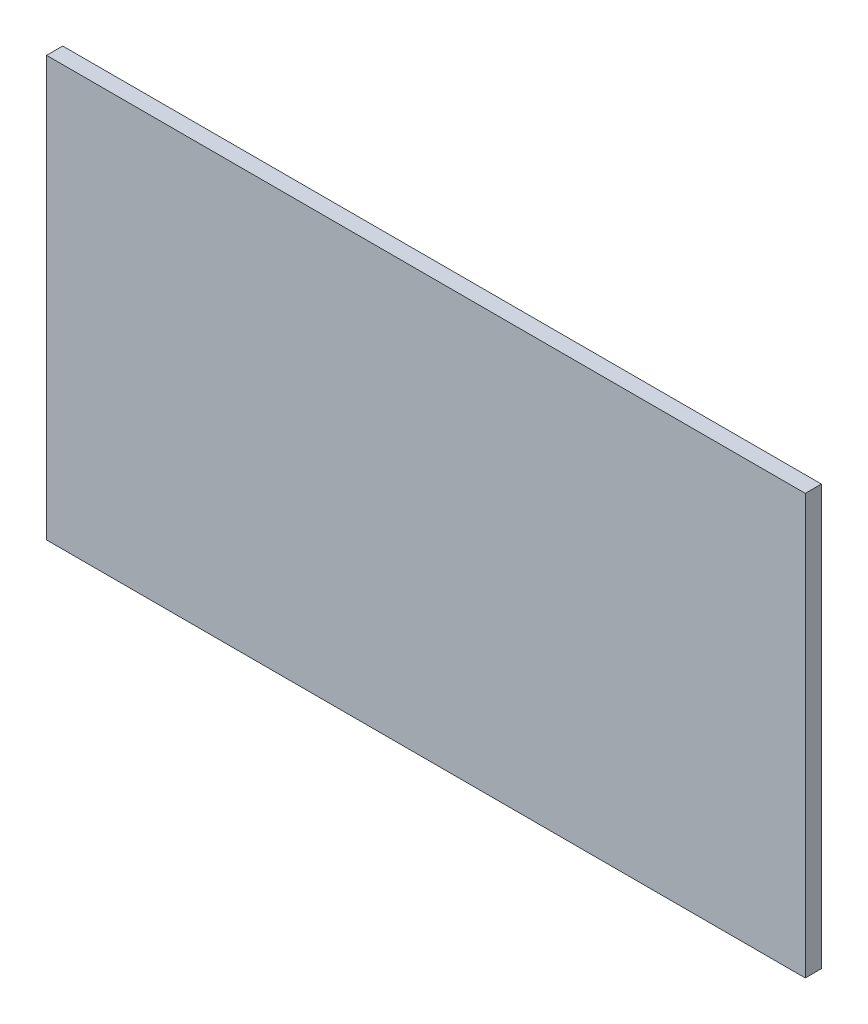
ISO-10303-21;
HEADER;
FILE_DESCRIPTION(('STEP AP214'),'2;1');
FILE_NAME('part.step','',(''),(''),'','','');
FILE_SCHEMA(('AUTOMOTIVE_DESIGN { 1 0 10303 214 1 1 1 1 }'));
ENDSEC;
DATA;
#1=APPLICATION_CONTEXT('core data for automotive mechanical design processes');
#2=APPLICATION_PROTOCOL_DEFINITION('international standard','automotive_design',2000,#1);
#3=PRODUCT_CONTEXT('',#1,'mechanical');
#4=PRODUCT('Part','Part','',(#3));
#5=PRODUCT_RELATED_PRODUCT_CATEGORY('part','',(#4));
#6=PRODUCT_DEFINITION_FORMATION('','',#4);
#7=PRODUCT_DEFINITION_CONTEXT('part definition',#1,'design');
#8=PRODUCT_DEFINITION('design','',#6,#7);
#9=PRODUCT_DEFINITION_SHAPE('','',#8);
#10=(LENGTH_UNIT() NAMED_UNIT(*) SI_UNIT(.MILLI.,.METRE.));
#11=(NAMED_UNIT(*) PLANE_ANGLE_UNIT() SI_UNIT($,.RADIAN.));
#12=(NAMED_UNIT(*) SI_UNIT($,.STERADIAN.) SOLID_ANGLE_UNIT());
#13=UNCERTAINTY_MEASURE_WITH_UNIT(LENGTH_MEASURE(1.E-05),#10,'distance_accuracy_value','');
#14=(GEOMETRIC_REPRESENTATION_CONTEXT(3) GLOBAL_UNCERTAINTY_ASSIGNED_CONTEXT((#13)) GLOBAL_UNIT_ASSIGNED_CONTEXT((#10,
#11,#12)) REPRESENTATION_CONTEXT('',''));
#15=CARTESIAN_POINT('',(0.,0.,0.));
#16=DIRECTION('',(0.,0.,1.));
#17=DIRECTION('',(1.,0.,0.));
#18=AXIS2_PLACEMENT_3D('',#15,#16,#17);
#19=CARTESIAN_POINT('',(-3.88690176456177,13.703029385592,39.9590420054778));
#20=DIRECTION('',(-1.,0.,0.));
#21=DIRECTION('',(0.,0.,1.));
#22=AXIS2_PLACEMENT_3D('',#19,#20,#21);
#23=PLANE('',#22);
#24=DIRECTION('',(0.,-1.,0.));
#25=VECTOR('',#24,1.);
#26=CARTESIAN_POINT('',(-3.88690176456177,13.703029385592,40.9590420054778));
#27=LINE('',#26,#25);
#28=CARTESIAN_POINT('',(-3.88690176456177,37.703029385592,40.9590420054778));
#29=VERTEX_POINT('',#28);
#30=CARTESIAN_POINT('',(-3.88690176456177,13.703029385592,40.9590420054778));
#31=VERTEX_POINT('',#30);
#32=EDGE_CURVE('E128',#29,#31,#27,.T.);
#33=ORIENTED_EDGE('',*,*,#32,.F.);
#34=DIRECTION('',(0.,0.,1.));
#35=VECTOR('',#34,1.);
#36=CARTESIAN_POINT('',(-3.88690176456177,37.703029385592,39.9590420054778));
#37=LINE('',#36,#35);
#38=CARTESIAN_POINT('',(-3.88690176456177,37.703029385592,39.9590420054778));
#39=VERTEX_POINT('',#38);
#40=EDGE_CURVE('E11',#39,#29,#37,.T.);
#41=ORIENTED_EDGE('',*,*,#40,.F.);
#42=DIRECTION('',(0.,-1.,0.));
#43=VECTOR('',#42,1.);
#44=CARTESIAN_POINT('',(-3.88690176456177,13.703029385592,39.9590420054778));
#45=LINE('',#44,#43);
#46=CARTESIAN_POINT('',(-3.88690176456177,13.703029385592,39.9590420054778));
#47=VERTEX_POINT('',#46);
#48=EDGE_CURVE('E137',#39,#47,#45,.T.);
#49=ORIENTED_EDGE('',*,*,#48,.T.);
#50=DIRECTION('',(0.,0.,1.));
#51=VECTOR('',#50,1.);
#52=CARTESIAN_POINT('',(-3.88690176456177,13.703029385592,39.9590420054778));
#53=LINE('',#52,#51);
#54=EDGE_CURVE('E36',#47,#31,#53,.T.);
#55=ORIENTED_EDGE('',*,*,#54,.T.);
#56=EDGE_LOOP('',(#33,#41,#49,#55));
#57=FACE_BOUND('',#56,.T.);
#58=ADVANCED_FACE('F33',(#57),#23,.T.);
#59=CARTESIAN_POINT('',(-3.88690176456177,37.703029385592,39.9590420054778));
#60=DIRECTION('',(0.,1.,0.));
#61=DIRECTION('',(0.,0.,1.));
#62=AXIS2_PLACEMENT_3D('',#59,#60,#61);
#63=PLANE('',#62);
#64=DIRECTION('',(-1.,0.,0.));
#65=VECTOR('',#64,1.);
#66=CARTESIAN_POINT('',(-3.88690176456177,37.703029385592,40.9590420054778));
#67=LINE('',#66,#65);
#68=CARTESIAN_POINT('',(41.1130982354382,37.703029385592,40.9590420054778));
#69=VERTEX_POINT('',#68);
#70=EDGE_CURVE('E140',#69,#29,#67,.T.);
#71=ORIENTED_EDGE('',*,*,#70,.F.);
#72=DIRECTION('',(0.,0.,1.));
#73=VECTOR('',#72,1.);
#74=CARTESIAN_POINT('',(41.1130982354382,37.703029385592,39.9590420054778));
#75=LINE('',#74,#73);
#76=CARTESIAN_POINT('',(41.1130982354382,37.703029385592,39.9590420054778));
#77=VERTEX_POINT('',#76);
#78=EDGE_CURVE('E42',#77,#69,#75,.T.);
#79=ORIENTED_EDGE('',*,*,#78,.F.);
#80=DIRECTION('',(-1.,0.,0.));
#81=VECTOR('',#80,1.);
#82=CARTESIAN_POINT('',(-3.88690176456177,37.703029385592,39.9590420054778));
#83=LINE('',#82,#81);
#84=EDGE_CURVE('E144',#77,#39,#83,.T.);
#85=ORIENTED_EDGE('',*,*,#84,.T.);
#86=ORIENTED_EDGE('',*,*,#40,.T.);
#87=EDGE_LOOP('',(#71,#79,#85,#86));
#88=FACE_BOUND('',#87,.T.);
#89=ADVANCED_FACE('F159',(#88),#63,.T.);
#90=CARTESIAN_POINT('',(41.1130982354382,13.703029385592,39.9590420054778));
#91=DIRECTION('',(1.,0.,0.));
#92=DIRECTION('',(0.,0.,-1.));
#93=AXIS2_PLACEMENT_3D('',#90,#91,#92);
#94=PLANE('',#93);
#95=DIRECTION('',(0.,1.,0.));
#96=VECTOR('',#95,1.);
#97=CARTESIAN_POINT('',(41.1130982354382,13.703029385592,40.9590420054778));
#98=LINE('',#97,#96);
#99=CARTESIAN_POINT('',(41.1130982354382,13.703029385592,40.9590420054778));
#100=VERTEX_POINT('',#99);
#101=EDGE_CURVE('E148',#100,#69,#98,.T.);
#102=ORIENTED_EDGE('',*,*,#101,.F.);
#103=DIRECTION('',(0.,0.,1.));
#104=VECTOR('',#103,1.);
#105=CARTESIAN_POINT('',(41.1130982354382,13.703029385592,39.9590420054778));
#106=LINE('',#105,#104);
#107=CARTESIAN_POINT('',(41.1130982354382,13.703029385592,39.9590420054778));
#108=VERTEX_POINT('',#107);
#109=EDGE_CURVE('E153',#108,#100,#106,.T.);
#110=ORIENTED_EDGE('',*,*,#109,.F.);
#111=DIRECTION('',(0.,1.,0.));
#112=VECTOR('',#111,1.);
#113=CARTESIAN_POINT('',(41.1130982354382,13.703029385592,39.9590420054778));
#114=LINE('',#113,#112);
#115=EDGE_CURVE('E142',#108,#77,#114,.T.);
#116=ORIENTED_EDGE('',*,*,#115,.T.);
#117=ORIENTED_EDGE('',*,*,#78,.T.);
#118=EDGE_LOOP('',(#102,#110,#116,#117));
#119=FACE_BOUND('',#118,.T.);
#120=ADVANCED_FACE('F162',(#119),#94,.T.);
#121=CARTESIAN_POINT('',(-3.88690176456177,13.703029385592,39.9590420054778));
#122=DIRECTION('',(0.,-1.,0.));
#123=DIRECTION('',(0.,0.,-1.));
#124=AXIS2_PLACEMENT_3D('',#121,#122,#123);
#125=PLANE('',#124);
#126=DIRECTION('',(1.,0.,0.));
#127=VECTOR('',#126,1.);
#128=CARTESIAN_POINT('',(-3.88690176456177,13.703029385592,40.9590420054778));
#129=LINE('',#128,#127);
#130=EDGE_CURVE('E131',#31,#100,#129,.T.);
#131=ORIENTED_EDGE('',*,*,#130,.F.);
#132=ORIENTED_EDGE('',*,*,#54,.F.);
#133=DIRECTION('',(1.,0.,0.));
#134=VECTOR('',#133,1.);
#135=CARTESIAN_POINT('',(-3.88690176456177,13.703029385592,39.9590420054778));
#136=LINE('',#135,#134);
#137=EDGE_CURVE('E139',#47,#108,#136,.T.);
#138=ORIENTED_EDGE('',*,*,#137,.T.);
#139=ORIENTED_EDGE('',*,*,#109,.T.);
#140=EDGE_LOOP('',(#131,#132,#138,#139));
#141=FACE_BOUND('',#140,.T.);
#142=ADVANCED_FACE('F155',(#141),#125,.T.);
#143=CARTESIAN_POINT('',(0.,0.,39.9590420054778));
#144=DIRECTION('',(0.,0.,-1.));
#145=DIRECTION('',(-1.,0.,0.));
#146=AXIS2_PLACEMENT_3D('',#143,#144,#145);
#147=PLANE('',#146);
#148=ORIENTED_EDGE('',*,*,#48,.F.);
#149=ORIENTED_EDGE('',*,*,#84,.F.);
#150=ORIENTED_EDGE('',*,*,#115,.F.);
#151=ORIENTED_EDGE('',*,*,#137,.F.);
#152=EDGE_LOOP('',(#148,#149,#150,#151));
#153=FACE_BOUND('',#152,.T.);
#154=ADVANCED_FACE('F164',(#153),#147,.T.);
#155=CARTESIAN_POINT('',(-4.88690176456177,38.703029385592,41.9590420054778));
#156=DIRECTION('',(1.,0.,0.));
#157=DIRECTION('',(0.,0.,-1.));
#158=AXIS2_PLACEMENT_3D('',#155,#156,#157);
#159=PLANE('',#158);
#160=DIRECTION('',(0.,-1.,0.));
#161=VECTOR('',#160,1.);
#162=CARTESIAN_POINT('',(-4.88690176456177,38.703029385592,40.9590420054778));
#163=LINE('',#162,#161);
#164=CARTESIAN_POINT('',(-4.88690176456177,38.703029385592,40.9590420054778));
#165=VERTEX_POINT('',#164);
#166=CARTESIAN_POINT('',(-4.88690176456177,12.703029385592,40.9590420054778));
#167=VERTEX_POINT('',#166);
#168=EDGE_CURVE('E127',#165,#167,#163,.T.);
#169=ORIENTED_EDGE('',*,*,#168,.T.);
#170=DIRECTION('',(0.,0.,-1.));
#171=VECTOR('',#170,1.);
#172=CARTESIAN_POINT('',(-4.88690176456177,12.703029385592,41.9590420054778));
#173=LINE('',#172,#171);
#174=CARTESIAN_POINT('',(-4.88690176456177,12.703029385592,41.9590420054778));
#175=VERTEX_POINT('',#174);
#176=EDGE_CURVE('E107',#175,#167,#173,.T.);
#177=ORIENTED_EDGE('',*,*,#176,.F.);
#178=DIRECTION('',(0.,-1.,0.));
#179=VECTOR('',#178,1.);
#180=CARTESIAN_POINT('',(-4.88690176456177,38.703029385592,41.9590420054778));
#181=LINE('',#180,#179);
#182=CARTESIAN_POINT('',(-4.88690176456177,38.703029385592,41.9590420054778));
#183=VERTEX_POINT('',#182);
#184=EDGE_CURVE('E114',#183,#175,#181,.T.);
#185=ORIENTED_EDGE('',*,*,#184,.F.);
#186=DIRECTION('',(0.,0.,-1.));
#187=VECTOR('',#186,1.);
#188=CARTESIAN_POINT('',(-4.88690176456177,38.703029385592,41.9590420054778));
#189=LINE('',#188,#187);
#190=EDGE_CURVE('E244',#183,#165,#189,.T.);
#191=ORIENTED_EDGE('',*,*,#190,.T.);
#192=EDGE_LOOP('',(#169,#177,#185,#191));
#193=FACE_BOUND('',#192,.T.);
#194=ADVANCED_FACE('F125',(#193),#159,.F.);
#195=CARTESIAN_POINT('',(-4.88690176456177,12.703029385592,41.9590420054778));
#196=DIRECTION('',(0.,1.,0.));
#197=DIRECTION('',(0.,0.,1.));
#198=AXIS2_PLACEMENT_3D('',#195,#196,#197);
#199=PLANE('',#198);
#200=DIRECTION('',(1.,0.,0.));
#201=VECTOR('',#200,1.);
#202=CARTESIAN_POINT('',(-4.88690176456177,12.703029385592,40.9590420054778));
#203=LINE('',#202,#201);
#204=CARTESIAN_POINT('',(42.1130982354382,12.703029385592,40.9590420054778));
#205=VERTEX_POINT('',#204);
#206=EDGE_CURVE('E250',#167,#205,#203,.T.);
#207=ORIENTED_EDGE('',*,*,#206,.T.);
#208=DIRECTION('',(0.,0.,-1.));
#209=VECTOR('',#208,1.);
#210=CARTESIAN_POINT('',(42.1130982354382,12.703029385592,41.9590420054778));
#211=LINE('',#210,#209);
#212=CARTESIAN_POINT('',(42.1130982354382,12.703029385592,41.9590420054778));
#213=VERTEX_POINT('',#212);
#214=EDGE_CURVE('E110',#213,#205,#211,.T.);
#215=ORIENTED_EDGE('',*,*,#214,.F.);
#216=DIRECTION('',(1.,0.,0.));
#217=VECTOR('',#216,1.);
#218=CARTESIAN_POINT('',(-4.88690176456177,12.703029385592,41.9590420054778));
#219=LINE('',#218,#217);
#220=EDGE_CURVE('E103',#175,#213,#219,.T.);
#221=ORIENTED_EDGE('',*,*,#220,.F.);
#222=ORIENTED_EDGE('',*,*,#176,.T.);
#223=EDGE_LOOP('',(#207,#215,#221,#222));
#224=FACE_BOUND('',#223,.T.);
#225=ADVANCED_FACE('F105',(#224),#199,.F.);
#226=CARTESIAN_POINT('',(42.1130982354382,38.703029385592,41.9590420054778));
#227=DIRECTION('',(-1.,0.,0.));
#228=DIRECTION('',(0.,0.,1.));
#229=AXIS2_PLACEMENT_3D('',#226,#227,#228);
#230=PLANE('',#229);
#231=DIRECTION('',(0.,1.,0.));
#232=VECTOR('',#231,1.);
#233=CARTESIAN_POINT('',(42.1130982354382,38.703029385592,40.9590420054778));
#234=LINE('',#233,#232);
#235=CARTESIAN_POINT('',(42.1130982354382,38.703029385592,40.9590420054778));
#236=VERTEX_POINT('',#235);
#237=EDGE_CURVE('E247',#205,#236,#234,.T.);
#238=ORIENTED_EDGE('',*,*,#237,.T.);
#239=DIRECTION('',(0.,0.,-1.));
#240=VECTOR('',#239,1.);
#241=CARTESIAN_POINT('',(42.1130982354382,38.703029385592,41.9590420054778));
#242=LINE('',#241,#240);
#243=CARTESIAN_POINT('',(42.1130982354382,38.703029385592,41.9590420054778));
#244=VERTEX_POINT('',#243);
#245=EDGE_CURVE('E133',#244,#236,#242,.T.);
#246=ORIENTED_EDGE('',*,*,#245,.F.);
#247=DIRECTION('',(0.,1.,0.));
#248=VECTOR('',#247,1.);
#249=CARTESIAN_POINT('',(42.1130982354382,38.703029385592,41.9590420054778));
#250=LINE('',#249,#248);
#251=EDGE_CURVE('E113',#213,#244,#250,.T.);
#252=ORIENTED_EDGE('',*,*,#251,.F.);
#253=ORIENTED_EDGE('',*,*,#214,.T.);
#254=EDGE_LOOP('',(#238,#246,#252,#253));
#255=FACE_BOUND('',#254,.T.);
#256=ADVANCED_FACE('F203',(#255),#230,.F.);
#257=CARTESIAN_POINT('',(-4.88690176456177,38.703029385592,41.9590420054778));
#258=DIRECTION('',(0.,-1.,0.));
#259=DIRECTION('',(0.,0.,-1.));
#260=AXIS2_PLACEMENT_3D('',#257,#258,#259);
#261=PLANE('',#260);
#262=DIRECTION('',(-1.,0.,0.));
#263=VECTOR('',#262,1.);
#264=CARTESIAN_POINT('',(-4.88690176456177,38.703029385592,40.9590420054778));
#265=LINE('',#264,#263);
#266=EDGE_CURVE('E123',#236,#165,#265,.T.);
#267=ORIENTED_EDGE('',*,*,#266,.T.);
#268=ORIENTED_EDGE('',*,*,#190,.F.);
#269=DIRECTION('',(-1.,0.,0.));
#270=VECTOR('',#269,1.);
#271=CARTESIAN_POINT('',(-4.88690176456177,38.703029385592,41.9590420054778));
#272=LINE('',#271,#270);
#273=EDGE_CURVE('E119',#244,#183,#272,.T.);
#274=ORIENTED_EDGE('',*,*,#273,.F.);
#275=ORIENTED_EDGE('',*,*,#245,.T.);
#276=EDGE_LOOP('',(#267,#268,#274,#275));
#277=FACE_BOUND('',#276,.T.);
#278=ADVANCED_FACE('F212',(#277),#261,.F.);
#279=CARTESIAN_POINT('',(0.,0.,41.9590420054778));
#280=DIRECTION('',(0.,0.,1.));
#281=DIRECTION('',(1.,0.,0.));
#282=AXIS2_PLACEMENT_3D('',#279,#280,#281);
#283=PLANE('',#282);
#284=ORIENTED_EDGE('',*,*,#184,.T.);
#285=ORIENTED_EDGE('',*,*,#220,.T.);
#286=ORIENTED_EDGE('',*,*,#251,.T.);
#287=ORIENTED_EDGE('',*,*,#273,.T.);
#288=EDGE_LOOP('',(#284,#285,#286,#287));
#289=FACE_BOUND('',#288,.T.);
#290=ADVANCED_FACE('F117',(#289),#283,.T.);
#291=CARTESIAN_POINT('',(0.,0.,40.9590420054778));
#292=DIRECTION('',(0.,0.,1.));
#293=DIRECTION('',(1.,0.,0.));
#294=AXIS2_PLACEMENT_3D('',#291,#292,#293);
#295=PLANE('',#294);
#296=ORIENTED_EDGE('',*,*,#32,.T.);
#297=ORIENTED_EDGE('',*,*,#130,.T.);
#298=ORIENTED_EDGE('',*,*,#101,.T.);
#299=ORIENTED_EDGE('',*,*,#70,.T.);
#300=EDGE_LOOP('',(#296,#297,#298,#299));
#301=FACE_BOUND('',#300,.T.);
#302=ORIENTED_EDGE('',*,*,#168,.F.);
#303=ORIENTED_EDGE('',*,*,#266,.F.);
#304=ORIENTED_EDGE('',*,*,#237,.F.);
#305=ORIENTED_EDGE('',*,*,#206,.F.);
#306=EDGE_LOOP('',(#302,#303,#304,#305));
#307=FACE_BOUND('',#306,.T.);
#308=ADVANCED_FACE('F157',(#301,#307),#295,.F.);
#309=CLOSED_SHELL('',(#58,#89,#120,#142,#154,#194,#225,#256,#278,#290,#308));
#310=MANIFOLD_SOLID_BREP('B2',#309);
#311=ADVANCED_BREP_SHAPE_REPRESENTATION('',(#18,#310),#14);
#312=SHAPE_DEFINITION_REPRESENTATION(#9,#311);
ENDSEC;
END-ISO-10303-21;
